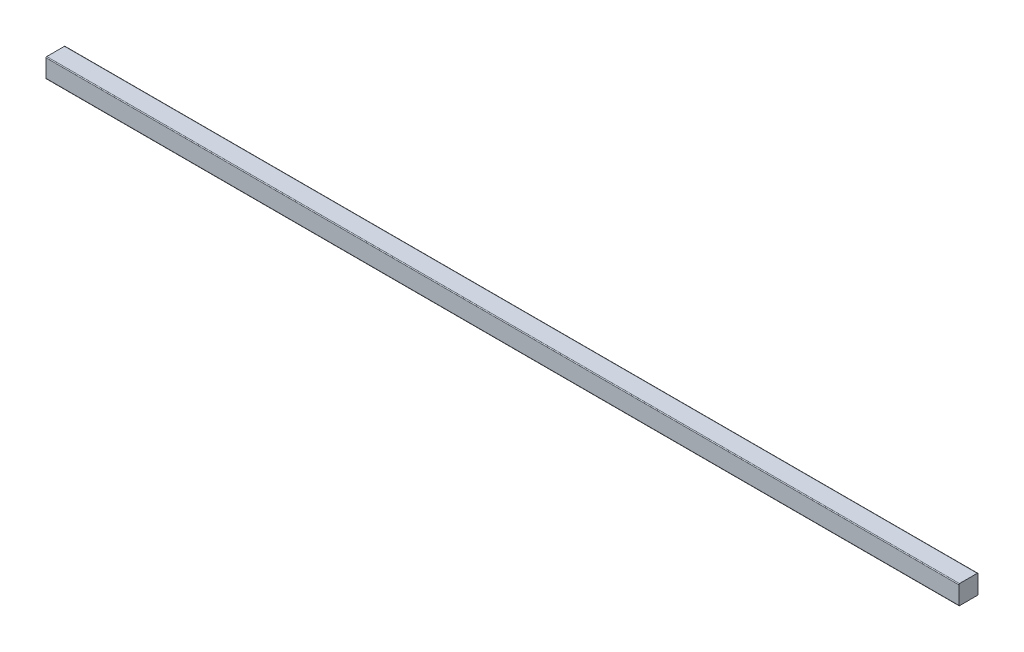
ISO-10303-21;
HEADER;
FILE_DESCRIPTION(('STEP AP214'),'2;1');
FILE_NAME('part.step','',(''),(''),'','','');
FILE_SCHEMA(('AUTOMOTIVE_DESIGN { 1 0 10303 214 1 1 1 1 }'));
ENDSEC;
DATA;
#1=APPLICATION_CONTEXT('core data for automotive mechanical design processes');
#2=APPLICATION_PROTOCOL_DEFINITION('international standard','automotive_design',2000,#1);
#3=PRODUCT_CONTEXT('',#1,'mechanical');
#4=PRODUCT('Part','Part','',(#3));
#5=PRODUCT_RELATED_PRODUCT_CATEGORY('part','',(#4));
#6=PRODUCT_DEFINITION_FORMATION('','',#4);
#7=PRODUCT_DEFINITION_CONTEXT('part definition',#1,'design');
#8=PRODUCT_DEFINITION('design','',#6,#7);
#9=PRODUCT_DEFINITION_SHAPE('','',#8);
#10=(LENGTH_UNIT() NAMED_UNIT(*) SI_UNIT(.MILLI.,.METRE.));
#11=(NAMED_UNIT(*) PLANE_ANGLE_UNIT() SI_UNIT($,.RADIAN.));
#12=(NAMED_UNIT(*) SI_UNIT($,.STERADIAN.) SOLID_ANGLE_UNIT());
#13=UNCERTAINTY_MEASURE_WITH_UNIT(LENGTH_MEASURE(1.E-05),#10,'distance_accuracy_value','');
#14=(GEOMETRIC_REPRESENTATION_CONTEXT(3) GLOBAL_UNCERTAINTY_ASSIGNED_CONTEXT((#13)) GLOBAL_UNIT_ASSIGNED_CONTEXT((#10,
#11,#12)) REPRESENTATION_CONTEXT('',''));
#15=CARTESIAN_POINT('',(0.,0.,0.));
#16=DIRECTION('',(0.,0.,1.));
#17=DIRECTION('',(1.,0.,0.));
#18=AXIS2_PLACEMENT_3D('',#15,#16,#17);
#19=CARTESIAN_POINT('',(301.625,-3.175,-3.175));
#20=DIRECTION('',(0.,0.,1.));
#21=DIRECTION('',(1.,0.,0.));
#22=AXIS2_PLACEMENT_3D('',#19,#20,#21);
#23=PLANE('',#22);
#24=DIRECTION('',(0.,1.,0.));
#25=VECTOR('',#24,1.);
#26=CARTESIAN_POINT('',(301.625,-3.175,-3.175));
#27=LINE('',#26,#25);
#28=CARTESIAN_POINT('',(301.625,-2.921,-3.175));
#29=VERTEX_POINT('',#28);
#30=CARTESIAN_POINT('',(301.625,2.921,-3.175));
#31=VERTEX_POINT('',#30);
#32=EDGE_CURVE('E124',#29,#31,#27,.T.);
#33=ORIENTED_EDGE('',*,*,#32,.F.);
#34=DIRECTION('',(-1.,0.,0.));
#35=VECTOR('',#34,1.);
#36=CARTESIAN_POINT('',(301.625,-2.921,-3.175));
#37=LINE('',#36,#35);
#38=CARTESIAN_POINT('',(0.,-2.921,-3.175));
#39=VERTEX_POINT('',#38);
#40=EDGE_CURVE('E109',#29,#39,#37,.T.);
#41=ORIENTED_EDGE('',*,*,#40,.T.);
#42=DIRECTION('',(0.,1.,0.));
#43=VECTOR('',#42,1.);
#44=CARTESIAN_POINT('',(0.,-3.175,-3.175));
#45=LINE('',#44,#43);
#46=CARTESIAN_POINT('',(0.,2.921,-3.175));
#47=VERTEX_POINT('',#46);
#48=EDGE_CURVE('E121',#39,#47,#45,.T.);
#49=ORIENTED_EDGE('',*,*,#48,.T.);
#50=DIRECTION('',(-1.,0.,0.));
#51=VECTOR('',#50,1.);
#52=CARTESIAN_POINT('',(301.625,2.921,-3.175));
#53=LINE('',#52,#51);
#54=EDGE_CURVE('E126',#47,#31,#53,.F.);
#55=ORIENTED_EDGE('',*,*,#54,.T.);
#56=EDGE_LOOP('',(#33,#41,#49,#55));
#57=FACE_BOUND('',#56,.T.);
#58=ADVANCED_FACE('F39',(#57),#23,.F.);
#59=CARTESIAN_POINT('',(301.625,3.175,3.175));
#60=DIRECTION('',(0.,-1.,0.));
#61=DIRECTION('',(0.,0.,-1.));
#62=AXIS2_PLACEMENT_3D('',#59,#60,#61);
#63=PLANE('',#62);
#64=DIRECTION('',(0.,0.,1.));
#65=VECTOR('',#64,1.);
#66=CARTESIAN_POINT('',(0.,3.175,3.175));
#67=LINE('',#66,#65);
#68=CARTESIAN_POINT('',(0.,3.175,-2.921));
#69=VERTEX_POINT('',#68);
#70=CARTESIAN_POINT('',(0.,3.175,2.921));
#71=VERTEX_POINT('',#70);
#72=EDGE_CURVE('E130',#69,#71,#67,.T.);
#73=ORIENTED_EDGE('',*,*,#72,.T.);
#74=DIRECTION('',(-1.,0.,0.));
#75=VECTOR('',#74,1.);
#76=CARTESIAN_POINT('',(301.625,3.175,2.921));
#77=LINE('',#76,#75);
#78=CARTESIAN_POINT('',(301.625,3.175,2.921));
#79=VERTEX_POINT('',#78);
#80=EDGE_CURVE('E11',#71,#79,#77,.F.);
#81=ORIENTED_EDGE('',*,*,#80,.T.);
#82=DIRECTION('',(0.,0.,1.));
#83=VECTOR('',#82,1.);
#84=CARTESIAN_POINT('',(301.625,3.175,3.175));
#85=LINE('',#84,#83);
#86=CARTESIAN_POINT('',(301.625,3.175,-2.921));
#87=VERTEX_POINT('',#86);
#88=EDGE_CURVE('E166',#87,#79,#85,.T.);
#89=ORIENTED_EDGE('',*,*,#88,.F.);
#90=DIRECTION('',(-1.,0.,0.));
#91=VECTOR('',#90,1.);
#92=CARTESIAN_POINT('',(301.625,3.175,-2.921));
#93=LINE('',#92,#91);
#94=EDGE_CURVE('E47',#87,#69,#93,.T.);
#95=ORIENTED_EDGE('',*,*,#94,.T.);
#96=EDGE_LOOP('',(#73,#81,#89,#95));
#97=FACE_BOUND('',#96,.T.);
#98=ADVANCED_FACE('F164',(#97),#63,.F.);
#99=CARTESIAN_POINT('',(301.625,-3.175,3.175));
#100=DIRECTION('',(0.,0.,-1.));
#101=DIRECTION('',(-1.,0.,0.));
#102=AXIS2_PLACEMENT_3D('',#99,#100,#101);
#103=PLANE('',#102);
#104=DIRECTION('',(0.,-1.,0.));
#105=VECTOR('',#104,1.);
#106=CARTESIAN_POINT('',(0.,-3.175,3.175));
#107=LINE('',#106,#105);
#108=CARTESIAN_POINT('',(0.,2.921,3.175));
#109=VERTEX_POINT('',#108);
#110=CARTESIAN_POINT('',(0.,-2.921,3.175));
#111=VERTEX_POINT('',#110);
#112=EDGE_CURVE('E133',#109,#111,#107,.T.);
#113=ORIENTED_EDGE('',*,*,#112,.T.);
#114=DIRECTION('',(-1.,0.,0.));
#115=VECTOR('',#114,1.);
#116=CARTESIAN_POINT('',(301.625,-2.921,3.175));
#117=LINE('',#116,#115);
#118=CARTESIAN_POINT('',(301.625,-2.921,3.175));
#119=VERTEX_POINT('',#118);
#120=EDGE_CURVE('E54',#111,#119,#117,.F.);
#121=ORIENTED_EDGE('',*,*,#120,.T.);
#122=DIRECTION('',(0.,-1.,0.));
#123=VECTOR('',#122,1.);
#124=CARTESIAN_POINT('',(301.625,-3.175,3.175));
#125=LINE('',#124,#123);
#126=CARTESIAN_POINT('',(301.625,2.921,3.175));
#127=VERTEX_POINT('',#126);
#128=EDGE_CURVE('E174',#127,#119,#125,.T.);
#129=ORIENTED_EDGE('',*,*,#128,.F.);
#130=DIRECTION('',(-1.,0.,0.));
#131=VECTOR('',#130,1.);
#132=CARTESIAN_POINT('',(301.625,2.921,3.175));
#133=LINE('',#132,#131);
#134=EDGE_CURVE('E157',#127,#109,#133,.T.);
#135=ORIENTED_EDGE('',*,*,#134,.T.);
#136=EDGE_LOOP('',(#113,#121,#129,#135));
#137=FACE_BOUND('',#136,.T.);
#138=ADVANCED_FACE('F173',(#137),#103,.F.);
#139=CARTESIAN_POINT('',(301.625,-3.175,3.175));
#140=DIRECTION('',(0.,1.,0.));
#141=DIRECTION('',(0.,0.,1.));
#142=AXIS2_PLACEMENT_3D('',#139,#140,#141);
#143=PLANE('',#142);
#144=DIRECTION('',(0.,0.,-1.));
#145=VECTOR('',#144,1.);
#146=CARTESIAN_POINT('',(0.,-3.175,3.175));
#147=LINE('',#146,#145);
#148=CARTESIAN_POINT('',(0.,-3.175,2.921));
#149=VERTEX_POINT('',#148);
#150=CARTESIAN_POINT('',(0.,-3.175,-2.921));
#151=VERTEX_POINT('',#150);
#152=EDGE_CURVE('E140',#149,#151,#147,.T.);
#153=ORIENTED_EDGE('',*,*,#152,.T.);
#154=DIRECTION('',(-1.,0.,0.));
#155=VECTOR('',#154,1.);
#156=CARTESIAN_POINT('',(301.625,-3.175,-2.921));
#157=LINE('',#156,#155);
#158=CARTESIAN_POINT('',(301.625,-3.175,-2.921));
#159=VERTEX_POINT('',#158);
#160=EDGE_CURVE('E110',#151,#159,#157,.F.);
#161=ORIENTED_EDGE('',*,*,#160,.T.);
#162=DIRECTION('',(0.,0.,-1.));
#163=VECTOR('',#162,1.);
#164=CARTESIAN_POINT('',(301.625,-3.175,3.175));
#165=LINE('',#164,#163);
#166=CARTESIAN_POINT('',(301.625,-3.175,2.921));
#167=VERTEX_POINT('',#166);
#168=EDGE_CURVE('E136',#167,#159,#165,.T.);
#169=ORIENTED_EDGE('',*,*,#168,.F.);
#170=DIRECTION('',(-1.,0.,0.));
#171=VECTOR('',#170,1.);
#172=CARTESIAN_POINT('',(301.625,-3.175,2.921));
#173=LINE('',#172,#171);
#174=EDGE_CURVE('E115',#167,#149,#173,.T.);
#175=ORIENTED_EDGE('',*,*,#174,.T.);
#176=EDGE_LOOP('',(#153,#161,#169,#175));
#177=FACE_BOUND('',#176,.T.);
#178=ADVANCED_FACE('F202',(#177),#143,.F.);
#179=CARTESIAN_POINT('',(301.625,0.,0.));
#180=DIRECTION('',(-1.,0.,0.));
#181=DIRECTION('',(0.,0.,1.));
#182=AXIS2_PLACEMENT_3D('',#179,#180,#181);
#183=PLANE('',#182);
#184=ORIENTED_EDGE('',*,*,#168,.T.);
#185=CARTESIAN_POINT('',(301.625,-2.921,-2.921));
#186=DIRECTION('',(-1.,0.,0.));
#187=DIRECTION('',(0.,0.,1.));
#188=AXIS2_PLACEMENT_3D('',#185,#186,#187);
#189=CIRCLE('',#188,0.254);
#190=EDGE_CURVE('E155',#159,#29,#189,.F.);
#191=ORIENTED_EDGE('',*,*,#190,.T.);
#192=ORIENTED_EDGE('',*,*,#32,.T.);
#193=CARTESIAN_POINT('',(301.625,2.921,-2.921));
#194=DIRECTION('',(-1.,0.,0.));
#195=DIRECTION('',(0.,0.,1.));
#196=AXIS2_PLACEMENT_3D('',#193,#194,#195);
#197=CIRCLE('',#196,0.254);
#198=EDGE_CURVE('E150',#31,#87,#197,.F.);
#199=ORIENTED_EDGE('',*,*,#198,.T.);
#200=ORIENTED_EDGE('',*,*,#88,.T.);
#201=CARTESIAN_POINT('',(301.625,2.921,2.921));
#202=DIRECTION('',(-1.,0.,0.));
#203=DIRECTION('',(0.,0.,1.));
#204=AXIS2_PLACEMENT_3D('',#201,#202,#203);
#205=CIRCLE('',#204,0.254);
#206=EDGE_CURVE('E61',#79,#127,#205,.F.);
#207=ORIENTED_EDGE('',*,*,#206,.T.);
#208=ORIENTED_EDGE('',*,*,#128,.T.);
#209=CARTESIAN_POINT('',(301.625,-2.921,2.921));
#210=DIRECTION('',(-1.,0.,0.));
#211=DIRECTION('',(0.,0.,1.));
#212=AXIS2_PLACEMENT_3D('',#209,#210,#211);
#213=CIRCLE('',#212,0.254);
#214=EDGE_CURVE('E153',#119,#167,#213,.F.);
#215=ORIENTED_EDGE('',*,*,#214,.T.);
#216=EDGE_LOOP('',(#184,#191,#192,#199,#200,#207,#208,#215));
#217=FACE_BOUND('',#216,.T.);
#218=ADVANCED_FACE('F179',(#217),#183,.F.);
#219=CARTESIAN_POINT('',(0.,0.,0.));
#220=DIRECTION('',(-1.,0.,0.));
#221=DIRECTION('',(0.,0.,1.));
#222=AXIS2_PLACEMENT_3D('',#219,#220,#221);
#223=PLANE('',#222);
#224=ORIENTED_EDGE('',*,*,#48,.F.);
#225=CARTESIAN_POINT('',(0.,-2.921,-2.921));
#226=DIRECTION('',(-1.,0.,0.));
#227=DIRECTION('',(0.,0.,1.));
#228=AXIS2_PLACEMENT_3D('',#225,#226,#227);
#229=CIRCLE('',#228,0.254);
#230=EDGE_CURVE('E105',#39,#151,#229,.T.);
#231=ORIENTED_EDGE('',*,*,#230,.T.);
#232=ORIENTED_EDGE('',*,*,#152,.F.);
#233=CARTESIAN_POINT('',(0.,-2.921,2.921));
#234=DIRECTION('',(-1.,0.,0.));
#235=DIRECTION('',(0.,0.,1.));
#236=AXIS2_PLACEMENT_3D('',#233,#234,#235);
#237=CIRCLE('',#236,0.254);
#238=EDGE_CURVE('E116',#149,#111,#237,.T.);
#239=ORIENTED_EDGE('',*,*,#238,.T.);
#240=ORIENTED_EDGE('',*,*,#112,.F.);
#241=CARTESIAN_POINT('',(0.,2.921,2.921));
#242=DIRECTION('',(-1.,0.,0.));
#243=DIRECTION('',(0.,0.,1.));
#244=AXIS2_PLACEMENT_3D('',#241,#242,#243);
#245=CIRCLE('',#244,0.254);
#246=EDGE_CURVE('E144',#109,#71,#245,.T.);
#247=ORIENTED_EDGE('',*,*,#246,.T.);
#248=ORIENTED_EDGE('',*,*,#72,.F.);
#249=CARTESIAN_POINT('',(0.,2.921,-2.921));
#250=DIRECTION('',(-1.,0.,0.));
#251=DIRECTION('',(0.,0.,1.));
#252=AXIS2_PLACEMENT_3D('',#249,#250,#251);
#253=CIRCLE('',#252,0.254);
#254=EDGE_CURVE('E125',#69,#47,#253,.T.);
#255=ORIENTED_EDGE('',*,*,#254,.T.);
#256=EDGE_LOOP('',(#224,#231,#232,#239,#240,#247,#248,#255));
#257=FACE_BOUND('',#256,.T.);
#258=ADVANCED_FACE('F128',(#257),#223,.T.);
#259=CARTESIAN_POINT('',(301.625,-2.921,-2.921));
#260=DIRECTION('',(-1.,0.,0.));
#261=DIRECTION('',(0.,0.,1.));
#262=AXIS2_PLACEMENT_3D('',#259,#260,#261);
#263=CYLINDRICAL_SURFACE('',#262,0.254);
#264=ORIENTED_EDGE('',*,*,#190,.F.);
#265=ORIENTED_EDGE('',*,*,#160,.F.);
#266=ORIENTED_EDGE('',*,*,#230,.F.);
#267=ORIENTED_EDGE('',*,*,#40,.F.);
#268=EDGE_LOOP('',(#264,#265,#266,#267));
#269=FACE_BOUND('',#268,.T.);
#270=ADVANCED_FACE('F108',(#269),#263,.T.);
#271=CARTESIAN_POINT('',(301.625,-2.921,2.921));
#272=DIRECTION('',(-1.,0.,0.));
#273=DIRECTION('',(0.,0.,1.));
#274=AXIS2_PLACEMENT_3D('',#271,#272,#273);
#275=CYLINDRICAL_SURFACE('',#274,0.254);
#276=ORIENTED_EDGE('',*,*,#214,.F.);
#277=ORIENTED_EDGE('',*,*,#120,.F.);
#278=ORIENTED_EDGE('',*,*,#238,.F.);
#279=ORIENTED_EDGE('',*,*,#174,.F.);
#280=EDGE_LOOP('',(#276,#277,#278,#279));
#281=FACE_BOUND('',#280,.T.);
#282=ADVANCED_FACE('F184',(#281),#275,.T.);
#283=CARTESIAN_POINT('',(301.625,2.921,2.921));
#284=DIRECTION('',(-1.,0.,0.));
#285=DIRECTION('',(0.,0.,1.));
#286=AXIS2_PLACEMENT_3D('',#283,#284,#285);
#287=CYLINDRICAL_SURFACE('',#286,0.254);
#288=ORIENTED_EDGE('',*,*,#206,.F.);
#289=ORIENTED_EDGE('',*,*,#80,.F.);
#290=ORIENTED_EDGE('',*,*,#246,.F.);
#291=ORIENTED_EDGE('',*,*,#134,.F.);
#292=EDGE_LOOP('',(#288,#289,#290,#291));
#293=FACE_BOUND('',#292,.T.);
#294=ADVANCED_FACE('F172',(#293),#287,.T.);
#295=CARTESIAN_POINT('',(301.625,2.921,-2.921));
#296=DIRECTION('',(-1.,0.,0.));
#297=DIRECTION('',(0.,0.,1.));
#298=AXIS2_PLACEMENT_3D('',#295,#296,#297);
#299=CYLINDRICAL_SURFACE('',#298,0.254);
#300=ORIENTED_EDGE('',*,*,#198,.F.);
#301=ORIENTED_EDGE('',*,*,#54,.F.);
#302=ORIENTED_EDGE('',*,*,#254,.F.);
#303=ORIENTED_EDGE('',*,*,#94,.F.);
#304=EDGE_LOOP('',(#300,#301,#302,#303));
#305=FACE_BOUND('',#304,.T.);
#306=ADVANCED_FACE('F41',(#305),#299,.T.);
#307=CLOSED_SHELL('',(#58,#98,#138,#178,#218,#258,#270,#282,#294,#306));
#308=MANIFOLD_SOLID_BREP('B2',#307);
#309=ADVANCED_BREP_SHAPE_REPRESENTATION('',(#18,#308),#14);
#310=SHAPE_DEFINITION_REPRESENTATION(#9,#309);
ENDSEC;
END-ISO-10303-21;
